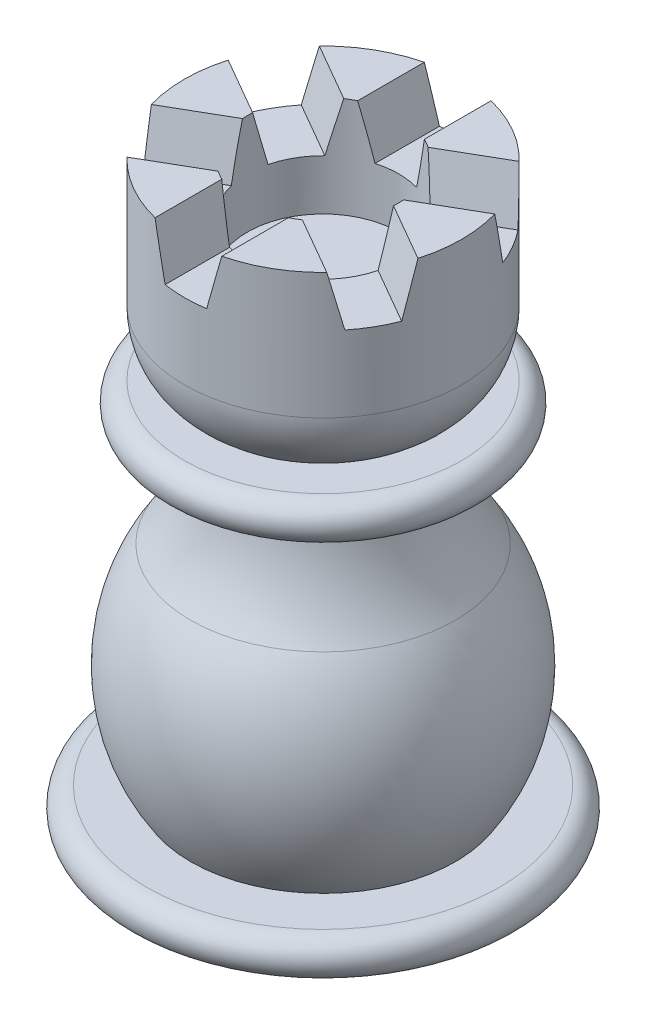
ISO-10303-21;
HEADER;
FILE_DESCRIPTION(('STEP AP214'),'2;1');
FILE_NAME('part.step','',(''),(''),'','','');
FILE_SCHEMA(('AUTOMOTIVE_DESIGN { 1 0 10303 214 1 1 1 1 }'));
ENDSEC;
DATA;
#1=APPLICATION_CONTEXT('core data for automotive mechanical design processes');
#2=APPLICATION_PROTOCOL_DEFINITION('international standard','automotive_design',2000,#1);
#3=PRODUCT_CONTEXT('',#1,'mechanical');
#4=PRODUCT('Part','Part','',(#3));
#5=PRODUCT_RELATED_PRODUCT_CATEGORY('part','',(#4));
#6=PRODUCT_DEFINITION_FORMATION('','',#4);
#7=PRODUCT_DEFINITION_CONTEXT('part definition',#1,'design');
#8=PRODUCT_DEFINITION('design','',#6,#7);
#9=PRODUCT_DEFINITION_SHAPE('','',#8);
#10=(LENGTH_UNIT() NAMED_UNIT(*) SI_UNIT(.MILLI.,.METRE.));
#11=(NAMED_UNIT(*) PLANE_ANGLE_UNIT() SI_UNIT($,.RADIAN.));
#12=(NAMED_UNIT(*) SI_UNIT($,.STERADIAN.) SOLID_ANGLE_UNIT());
#13=UNCERTAINTY_MEASURE_WITH_UNIT(LENGTH_MEASURE(1.E-05),#10,'distance_accuracy_value','');
#14=(GEOMETRIC_REPRESENTATION_CONTEXT(3) GLOBAL_UNCERTAINTY_ASSIGNED_CONTEXT((#13)) GLOBAL_UNIT_ASSIGNED_CONTEXT((#10,
#11,#12)) REPRESENTATION_CONTEXT('',''));
#15=CARTESIAN_POINT('',(0.,0.,0.));
#16=DIRECTION('',(0.,0.,1.));
#17=DIRECTION('',(1.,0.,0.));
#18=AXIS2_PLACEMENT_3D('',#15,#16,#17);
#19=CARTESIAN_POINT('',(0.,0.,0.));
#20=DIRECTION('',(0.,-1.,0.));
#21=DIRECTION('',(0.,0.,-1.));
#22=AXIS2_PLACEMENT_3D('',#19,#20,#21);
#23=PLANE('',#22);
#24=CARTESIAN_POINT('',(0.,0.,0.));
#25=DIRECTION('',(0.,1.,0.));
#26=DIRECTION('',(0.,0.,1.));
#27=AXIS2_PLACEMENT_3D('',#24,#25,#26);
#28=CIRCLE('',#27,11.0000000000006);
#29=CARTESIAN_POINT('',(10.5695682168455,0.,3.04700307014324));
#30=VERTEX_POINT('',#29);
#31=CARTESIAN_POINT('',(10.5695682168455,0.,-3.04700307014338));
#32=VERTEX_POINT('',#31);
#33=EDGE_CURVE('E392',#30,#32,#28,.T.);
#34=ORIENTED_EDGE('',*,*,#33,.T.);
#35=DIRECTION('',(0.866025403784436,0.,-0.500000000000004));
#36=VECTOR('',#35,1.);
#37=CARTESIAN_POINT('',(-17.0136958571946,0.,12.8782018681324));
#38=LINE('',#37,#36);
#39=CARTESIAN_POINT('',(5.98658386007074,0.,-0.40101581806761));
#40=VERTEX_POINT('',#39);
#41=EDGE_CURVE('E282',#40,#32,#38,.T.);
#42=ORIENTED_EDGE('',*,*,#41,.F.);
#43=CARTESIAN_POINT('',(0.,0.,0.));
#44=DIRECTION('',(0.,1.,0.));
#45=DIRECTION('',(0.,0.,1.));
#46=AXIS2_PLACEMENT_3D('',#43,#44,#45);
#47=CIRCLE('',#46,6.);
#48=CARTESIAN_POINT('',(5.98658386007075,0.,0.401015818067528));
#49=VERTEX_POINT('',#48);
#50=EDGE_CURVE('E305',#49,#40,#47,.T.);
#51=ORIENTED_EDGE('',*,*,#50,.F.);
#52=DIRECTION('',(-0.866025403784443,0.,-0.499999999999992));
#53=VECTOR('',#52,1.);
#54=CARTESIAN_POINT('',(19.6596979014642,0.,8.2951918905263));
#55=LINE('',#54,#53);
#56=EDGE_CURVE('E265',#30,#49,#55,.T.);
#57=ORIENTED_EDGE('',*,*,#56,.F.);
#58=EDGE_LOOP('',(#34,#42,#51,#57));
#59=FACE_BOUND('',#58,.T.);
#60=ADVANCED_FACE('F43',(#59),#23,.F.);
#61=CARTESIAN_POINT('',(2.64600204426945,0.,10.6770161178925));
#62=VERTEX_POINT('',#61);
#63=CARTESIAN_POINT('',(7.92356617257607,0.,7.63001304774911));
#64=VERTEX_POINT('',#63);
#65=EDGE_CURVE('E300',#62,#64,#28,.T.);
#66=ORIENTED_EDGE('',*,*,#65,.T.);
#67=DIRECTION('',(0.86602540378444,0.,0.499999999999998));
#68=VECTOR('',#67,1.);
#69=CARTESIAN_POINT('',(-19.6596979014641,0.,-8.29519189052646));
#70=LINE('',#69,#68);
#71=CARTESIAN_POINT('',(3.34058181580131,0.,4.98402579567338));
#72=VERTEX_POINT('',#71);
#73=EDGE_CURVE('E276',#72,#64,#70,.T.);
#74=ORIENTED_EDGE('',*,*,#73,.F.);
#75=CARTESIAN_POINT('',(2.64600204426945,0.,5.38504161374097));
#76=VERTEX_POINT('',#75);
#77=EDGE_CURVE('E299',#76,#72,#47,.T.);
#78=ORIENTED_EDGE('',*,*,#77,.F.);
#79=DIRECTION('',(0.,0.,-1.));
#80=VECTOR('',#79,1.);
#81=CARTESIAN_POINT('',(2.64600204426945,0.,15.5));
#82=LINE('',#81,#80);
#83=EDGE_CURVE('E267',#62,#76,#82,.T.);
#84=ORIENTED_EDGE('',*,*,#83,.F.);
#85=EDGE_LOOP('',(#66,#74,#78,#84));
#86=FACE_BOUND('',#85,.T.);
#87=ADVANCED_FACE('F297',(#86),#23,.F.);
#88=CARTESIAN_POINT('',(-3.34058181580128,0.,4.9840257956734));
#89=VERTEX_POINT('',#88);
#90=CARTESIAN_POINT('',(-2.64600204426945,0.,5.38504161374096));
#91=VERTEX_POINT('',#90);
#92=EDGE_CURVE('E313',#89,#91,#47,.T.);
#93=ORIENTED_EDGE('',*,*,#92,.F.);
#94=CARTESIAN_POINT('',(-7.92356617257602,0.,7.63001304774917));
#95=VERTEX_POINT('',#94);
#96=EDGE_CURVE('E281',#95,#89,#38,.T.);
#97=ORIENTED_EDGE('',*,*,#96,.F.);
#98=CARTESIAN_POINT('',(-2.64600204426945,0.,10.6770161178925));
#99=VERTEX_POINT('',#98);
#100=EDGE_CURVE('E376',#95,#99,#28,.T.);
#101=ORIENTED_EDGE('',*,*,#100,.T.);
#102=DIRECTION('',(0.,0.,1.));
#103=VECTOR('',#102,1.);
#104=CARTESIAN_POINT('',(-2.64600204426945,0.,-15.5));
#105=LINE('',#104,#103);
#106=EDGE_CURVE('E337',#91,#99,#105,.T.);
#107=ORIENTED_EDGE('',*,*,#106,.F.);
#108=EDGE_LOOP('',(#93,#97,#101,#107));
#109=FACE_BOUND('',#108,.T.);
#110=ADVANCED_FACE('F418',(#109),#23,.F.);
#111=CARTESIAN_POINT('',(-5.98658386007075,0.,-0.401015818067571));
#112=VERTEX_POINT('',#111);
#113=CARTESIAN_POINT('',(-5.98658386007075,0.,0.40101581806766));
#114=VERTEX_POINT('',#113);
#115=EDGE_CURVE('E316',#112,#114,#47,.T.);
#116=ORIENTED_EDGE('',*,*,#115,.F.);
#117=CARTESIAN_POINT('',(-10.5695682168455,0.,-3.0470030701433));
#118=VERTEX_POINT('',#117);
#119=EDGE_CURVE('E285',#118,#112,#70,.T.);
#120=ORIENTED_EDGE('',*,*,#119,.F.);
#121=CARTESIAN_POINT('',(-10.5695682168455,0.,3.04700307014346));
#122=VERTEX_POINT('',#121);
#123=EDGE_CURVE('E379',#118,#122,#28,.T.);
#124=ORIENTED_EDGE('',*,*,#123,.T.);
#125=DIRECTION('',(-0.866025403784433,0.,0.50000000000001));
#126=VECTOR('',#125,1.);
#127=CARTESIAN_POINT('',(17.0136958571946,0.,-12.8782018681325));
#128=LINE('',#127,#126);
#129=EDGE_CURVE('E271',#114,#122,#128,.T.);
#130=ORIENTED_EDGE('',*,*,#129,.F.);
#131=EDGE_LOOP('',(#116,#120,#124,#130));
#132=FACE_BOUND('',#131,.T.);
#133=ADVANCED_FACE('F420',(#132),#23,.F.);
#134=CARTESIAN_POINT('',(7.92356617257596,0.,-7.63001304774922));
#135=VERTEX_POINT('',#134);
#136=CARTESIAN_POINT('',(2.64600204426945,0.,-10.6770161178925));
#137=VERTEX_POINT('',#136);
#138=EDGE_CURVE('E384',#135,#137,#28,.T.);
#139=ORIENTED_EDGE('',*,*,#138,.T.);
#140=CARTESIAN_POINT('',(2.64600204426945,0.,-5.38504161374096));
#141=VERTEX_POINT('',#140);
#142=EDGE_CURVE('E264',#141,#137,#82,.T.);
#143=ORIENTED_EDGE('',*,*,#142,.F.);
#144=CARTESIAN_POINT('',(3.34058181580124,0.,-4.98402579567342));
#145=VERTEX_POINT('',#144);
#146=EDGE_CURVE('E312',#145,#141,#47,.T.);
#147=ORIENTED_EDGE('',*,*,#146,.F.);
#148=EDGE_CURVE('E444',#135,#145,#128,.T.);
#149=ORIENTED_EDGE('',*,*,#148,.F.);
#150=EDGE_LOOP('',(#139,#143,#147,#149));
#151=FACE_BOUND('',#150,.T.);
#152=ADVANCED_FACE('F425',(#151),#23,.F.);
#153=CARTESIAN_POINT('',(-2.64600204426945,0.,-10.6770161178925));
#154=VERTEX_POINT('',#153);
#155=CARTESIAN_POINT('',(-7.92356617257611,0.,-7.63001304774905));
#156=VERTEX_POINT('',#155);
#157=EDGE_CURVE('E382',#154,#156,#28,.T.);
#158=ORIENTED_EDGE('',*,*,#157,.T.);
#159=CARTESIAN_POINT('',(-3.34058181580134,0.,-4.98402579567335));
#160=VERTEX_POINT('',#159);
#161=EDGE_CURVE('E205',#160,#156,#55,.T.);
#162=ORIENTED_EDGE('',*,*,#161,.F.);
#163=CARTESIAN_POINT('',(-2.64600204426945,0.,-5.38504161374097));
#164=VERTEX_POINT('',#163);
#165=EDGE_CURVE('E307',#164,#160,#47,.T.);
#166=ORIENTED_EDGE('',*,*,#165,.F.);
#167=EDGE_CURVE('E340',#154,#164,#105,.T.);
#168=ORIENTED_EDGE('',*,*,#167,.F.);
#169=EDGE_LOOP('',(#158,#162,#166,#168));
#170=FACE_BOUND('',#169,.T.);
#171=ADVANCED_FACE('F45',(#170),#23,.F.);
#172=CARTESIAN_POINT('',(0.,0.,0.));
#173=DIRECTION('',(0.,1.,0.));
#174=DIRECTION('',(0.,0.,1.));
#175=AXIS2_PLACEMENT_3D('',#172,#173,#174);
#176=CYLINDRICAL_SURFACE('',#175,11.0000000000006);
#177=ORIENTED_EDGE('',*,*,#65,.F.);
#178=CARTESIAN_POINT('',(0.,-10.6125345492527,0.));
#179=DIRECTION('',(0.970295726275996,-0.241921895599669,0.));
#180=DIRECTION('',(0.241921895599669,0.970295726275996,0.));
#181=AXIS2_PLACEMENT_3D('',#178,#179,#180);
#182=ELLIPSE('',#181,45.4692204388286,11.0000000000006);
#183=CARTESIAN_POINT('',(1.64869003289672,-4.,10.8757446262516));
#184=VERTEX_POINT('',#183);
#185=EDGE_CURVE('E243',#62,#184,#182,.T.);
#186=ORIENTED_EDGE('',*,*,#185,.T.);
#187=CARTESIAN_POINT('',(0.,-4.,0.));
#188=DIRECTION('',(0.,-1.,0.));
#189=DIRECTION('',(1.,0.,0.));
#190=AXIS2_PLACEMENT_3D('',#187,#188,#189);
#191=CIRCLE('',#190,11.0000000000006);
#192=CARTESIAN_POINT('',(-1.64869003289672,-4.,10.8757446262516));
#193=VERTEX_POINT('',#192);
#194=EDGE_CURVE('E321',#184,#193,#191,.T.);
#195=ORIENTED_EDGE('',*,*,#194,.T.);
#196=CARTESIAN_POINT('',(0.,-10.6125345492527,0.));
#197=DIRECTION('',(-0.970295726275996,-0.241921895599669,0.));
#198=DIRECTION('',(-0.241921895599669,0.970295726275996,0.));
#199=AXIS2_PLACEMENT_3D('',#196,#197,#198);
#200=ELLIPSE('',#199,45.4692204388286,11.0000000000006);
#201=EDGE_CURVE('E334',#193,#99,#200,.T.);
#202=ORIENTED_EDGE('',*,*,#201,.T.);
#203=ORIENTED_EDGE('',*,*,#100,.F.);
#204=CARTESIAN_POINT('',(0.,-10.6125345492527,0.));
#205=DIRECTION('',(0.485147863138002,-0.241921895599669,0.840300748138482));
#206=DIRECTION('',(0.120960947799835,0.970295726275996,0.209510507321));
#207=AXIS2_PLACEMENT_3D('',#204,#205,#206);
#208=ELLIPSE('',#207,45.4692204388286,11.0000000000006);
#209=CARTESIAN_POINT('',(-8.59432611495759,-4.,6.8656797645806));
#210=VERTEX_POINT('',#209);
#211=EDGE_CURVE('E349',#95,#210,#208,.T.);
#212=ORIENTED_EDGE('',*,*,#211,.T.);
#213=CARTESIAN_POINT('',(0.,-4.,0.));
#214=DIRECTION('',(0.,-1.,0.));
#215=DIRECTION('',(0.,0.,-1.));
#216=AXIS2_PLACEMENT_3D('',#213,#214,#215);
#217=CIRCLE('',#216,11.0000000000006);
#218=CARTESIAN_POINT('',(-10.2430161478543,-4.,4.01006486167109));
#219=VERTEX_POINT('',#218);
#220=EDGE_CURVE('E230',#210,#219,#217,.T.);
#221=ORIENTED_EDGE('',*,*,#220,.T.);
#222=CARTESIAN_POINT('',(0.,-10.6125345492527,0.));
#223=DIRECTION('',(-0.485147863138008,-0.241921895599669,-0.840300748138479));
#224=DIRECTION('',(-0.120960947799837,0.970295726275996,-0.209510507320999));
#225=AXIS2_PLACEMENT_3D('',#222,#223,#224);
#226=ELLIPSE('',#225,45.4692204388286,11.0000000000006);
#227=EDGE_CURVE('E352',#219,#122,#226,.T.);
#228=ORIENTED_EDGE('',*,*,#227,.T.);
#229=ORIENTED_EDGE('',*,*,#123,.F.);
#230=CARTESIAN_POINT('',(0.,-10.6125345492527,0.));
#231=DIRECTION('',(-0.485147863137996,-0.241921895599669,0.840300748138486));
#232=DIRECTION('',(-0.120960947799834,0.970295726275996,0.209510507321));
#233=AXIS2_PLACEMENT_3D('',#230,#231,#232);
#234=ELLIPSE('',#233,45.4692204388286,11.0000000000006);
#235=CARTESIAN_POINT('',(-10.2430161478543,-4.,-4.01006486167101));
#236=VERTEX_POINT('',#235);
#237=EDGE_CURVE('E229',#118,#236,#234,.T.);
#238=ORIENTED_EDGE('',*,*,#237,.T.);
#239=CARTESIAN_POINT('',(-8.59432611495765,-4.,-6.86567976458055));
#240=VERTEX_POINT('',#239);
#241=EDGE_CURVE('E216',#236,#240,#217,.T.);
#242=ORIENTED_EDGE('',*,*,#241,.T.);
#243=CARTESIAN_POINT('',(0.,-10.6125345492527,0.));
#244=DIRECTION('',(0.48514786313799,-0.241921895599669,-0.840300748138489));
#245=DIRECTION('',(0.120960947799832,0.970295726275996,-0.209510507321001));
#246=AXIS2_PLACEMENT_3D('',#243,#244,#245);
#247=ELLIPSE('',#246,45.4692204388286,11.0000000000006);
#248=EDGE_CURVE('E202',#240,#156,#247,.T.);
#249=ORIENTED_EDGE('',*,*,#248,.T.);
#250=ORIENTED_EDGE('',*,*,#157,.F.);
#251=CARTESIAN_POINT('',(-1.64869003289672,-4.,-10.8757446262516));
#252=VERTEX_POINT('',#251);
#253=EDGE_CURVE('E332',#154,#252,#200,.T.);
#254=ORIENTED_EDGE('',*,*,#253,.T.);
#255=CARTESIAN_POINT('',(1.64869003289672,-4.,-10.8757446262516));
#256=VERTEX_POINT('',#255);
#257=EDGE_CURVE('E326',#252,#256,#191,.T.);
#258=ORIENTED_EDGE('',*,*,#257,.T.);
#259=CARTESIAN_POINT('',(0.,-10.6125345492527,0.));
#260=DIRECTION('',(0.970295726275996,-0.241921895599669,0.));
#261=DIRECTION('',(0.241921895599669,0.970295726275996,0.));
#262=AXIS2_PLACEMENT_3D('',#259,#260,#261);
#263=ELLIPSE('',#262,45.4692204388286,11.0000000000006);
#264=EDGE_CURVE('E359',#256,#137,#263,.T.);
#265=ORIENTED_EDGE('',*,*,#264,.T.);
#266=ORIENTED_EDGE('',*,*,#138,.F.);
#267=CARTESIAN_POINT('',(0.,-10.6125345492527,0.));
#268=DIRECTION('',(-0.485147863138008,-0.241921895599669,-0.840300748138479));
#269=DIRECTION('',(-0.120960947799837,0.970295726275996,-0.209510507320999));
#270=AXIS2_PLACEMENT_3D('',#267,#268,#269);
#271=ELLIPSE('',#270,45.4692204388286,11.0000000000006);
#272=CARTESIAN_POINT('',(8.59432611495753,-4.,-6.86567976458066));
#273=VERTEX_POINT('',#272);
#274=EDGE_CURVE('E210',#135,#273,#271,.T.);
#275=ORIENTED_EDGE('',*,*,#274,.T.);
#276=CARTESIAN_POINT('',(10.2430161478543,-4.,-4.01006486167108));
#277=VERTEX_POINT('',#276);
#278=EDGE_CURVE('E232',#273,#277,#217,.T.);
#279=ORIENTED_EDGE('',*,*,#278,.T.);
#280=CARTESIAN_POINT('',(0.,-10.6125345492527,0.));
#281=DIRECTION('',(0.485147863138002,-0.241921895599669,0.840300748138482));
#282=DIRECTION('',(0.120960947799835,0.970295726275996,0.209510507321));
#283=AXIS2_PLACEMENT_3D('',#280,#281,#282);
#284=ELLIPSE('',#283,45.4692204388286,11.0000000000006);
#285=EDGE_CURVE('E355',#277,#32,#284,.T.);
#286=ORIENTED_EDGE('',*,*,#285,.T.);
#287=ORIENTED_EDGE('',*,*,#33,.F.);
#288=CARTESIAN_POINT('',(0.,-10.6125345492527,0.));
#289=DIRECTION('',(0.48514786313799,-0.241921895599669,-0.840300748138489));
#290=DIRECTION('',(0.120960947799832,0.970295726275996,-0.209510507321001));
#291=AXIS2_PLACEMENT_3D('',#288,#289,#290);
#292=ELLIPSE('',#291,45.4692204388286,11.0000000000006);
#293=CARTESIAN_POINT('',(10.2430161478544,-4.,4.01006486167095));
#294=VERTEX_POINT('',#293);
#295=EDGE_CURVE('E211',#30,#294,#292,.T.);
#296=ORIENTED_EDGE('',*,*,#295,.T.);
#297=CARTESIAN_POINT('',(8.59432611495763,-4.,6.86567976458054));
#298=VERTEX_POINT('',#297);
#299=EDGE_CURVE('E234',#294,#298,#217,.T.);
#300=ORIENTED_EDGE('',*,*,#299,.T.);
#301=CARTESIAN_POINT('',(0.,-10.6125345492527,0.));
#302=DIRECTION('',(-0.485147863137996,-0.241921895599669,0.840300748138486));
#303=DIRECTION('',(-0.120960947799834,0.970295726275996,0.209510507321));
#304=AXIS2_PLACEMENT_3D('',#301,#302,#303);
#305=ELLIPSE('',#304,45.4692204388286,11.0000000000006);
#306=EDGE_CURVE('E247',#298,#64,#305,.T.);
#307=ORIENTED_EDGE('',*,*,#306,.T.);
#308=EDGE_LOOP('',(#177,#186,#195,#202,#203,#212,#221,#228,#229,#238,#242,#249,#250,#254,#258,
#265,#266,#275,#279,#286,#287,#296,#300,#307));
#309=FACE_BOUND('',#308,.T.);
#310=CARTESIAN_POINT('',(0.,-10.,0.));
#311=DIRECTION('',(0.,1.,0.));
#312=DIRECTION('',(0.,0.,1.));
#313=AXIS2_PLACEMENT_3D('',#310,#311,#312);
#314=CIRCLE('',#313,11.0000000000006);
#315=CARTESIAN_POINT('',(0.,-10.,11.0000000000006));
#316=VERTEX_POINT('',#315);
#317=EDGE_CURVE('E380',#316,#316,#314,.T.);
#318=ORIENTED_EDGE('',*,*,#317,.T.);
#319=EDGE_LOOP('',(#318));
#320=FACE_BOUND('',#319,.T.);
#321=ADVANCED_FACE('F226',(#309,#320),#176,.T.);
#322=CARTESIAN_POINT('',(0.,-10.,0.));
#323=DIRECTION('',(0.,1.,0.));
#324=DIRECTION('',(0.,0.,1.));
#325=AXIS2_PLACEMENT_3D('',#322,#323,#324);
#326=DEGENERATE_TOROIDAL_SURFACE('',#325,5.00000000000061,5.99999999999985,.T.);
#327=ORIENTED_EDGE('',*,*,#317,.F.);
#328=EDGE_LOOP('',(#327));
#329=FACE_BOUND('',#328,.T.);
#330=CARTESIAN_POINT('',(0.,-15.1961524227068,0.));
#331=DIRECTION('',(0.,1.,0.));
#332=DIRECTION('',(0.,0.,1.));
#333=AXIS2_PLACEMENT_3D('',#330,#331,#332);
#334=CIRCLE('',#333,8.00000000000008);
#335=CARTESIAN_POINT('',(0.,-15.1961524227068,8.00000000000008));
#336=VERTEX_POINT('',#335);
#337=EDGE_CURVE('E386',#336,#336,#334,.T.);
#338=ORIENTED_EDGE('',*,*,#337,.T.);
#339=EDGE_LOOP('',(#338));
#340=FACE_BOUND('',#339,.T.);
#341=ADVANCED_FACE('F436',(#329,#340),#326,.T.);
#342=CARTESIAN_POINT('',(8.,-15.1961524227067,0.));
#343=DIRECTION('',(0.,-1.,0.));
#344=DIRECTION('',(0.,0.,-1.));
#345=AXIS2_PLACEMENT_3D('',#342,#343,#344);
#346=PLANE('',#345);
#347=ORIENTED_EDGE('',*,*,#337,.F.);
#348=EDGE_LOOP('',(#347));
#349=FACE_BOUND('',#348,.T.);
#350=CARTESIAN_POINT('',(0.,-15.1961524227066,0.));
#351=DIRECTION('',(0.,1.,0.));
#352=DIRECTION('',(0.,0.,1.));
#353=AXIS2_PLACEMENT_3D('',#350,#351,#352);
#354=CIRCLE('',#353,11.);
#355=CARTESIAN_POINT('',(0.,-15.1961524227066,11.));
#356=VERTEX_POINT('',#355);
#357=EDGE_CURVE('E768',#356,#356,#354,.T.);
#358=ORIENTED_EDGE('',*,*,#357,.T.);
#359=EDGE_LOOP('',(#358));
#360=FACE_BOUND('',#359,.T.);
#361=ADVANCED_FACE('F716',(#349,#360),#346,.F.);
#362=CARTESIAN_POINT('',(0.,-16.6961524227066,0.));
#363=DIRECTION('',(0.,1.,0.));
#364=DIRECTION('',(0.,0.,1.));
#365=AXIS2_PLACEMENT_3D('',#362,#363,#364);
#366=TOROIDAL_SURFACE('',#365,11.,1.5);
#367=ORIENTED_EDGE('',*,*,#357,.F.);
#368=EDGE_LOOP('',(#367));
#369=FACE_BOUND('',#368,.T.);
#370=CARTESIAN_POINT('',(0.,-18.1961524227066,0.));
#371=DIRECTION('',(0.,1.,0.));
#372=DIRECTION('',(0.,0.,1.));
#373=AXIS2_PLACEMENT_3D('',#370,#371,#372);
#374=CIRCLE('',#373,11.);
#375=CARTESIAN_POINT('',(0.,-18.1961524227066,11.));
#376=VERTEX_POINT('',#375);
#377=EDGE_CURVE('E771',#376,#376,#374,.T.);
#378=ORIENTED_EDGE('',*,*,#377,.T.);
#379=EDGE_LOOP('',(#378));
#380=FACE_BOUND('',#379,.T.);
#381=ADVANCED_FACE('F707',(#369,#380),#366,.T.);
#382=CARTESIAN_POINT('',(11.,-18.1961524227066,0.));
#383=DIRECTION('',(0.,1.,0.));
#384=DIRECTION('',(0.,0.,1.));
#385=AXIS2_PLACEMENT_3D('',#382,#383,#384);
#386=PLANE('',#385);
#387=ORIENTED_EDGE('',*,*,#377,.F.);
#388=EDGE_LOOP('',(#387));
#389=FACE_BOUND('',#388,.T.);
#390=CARTESIAN_POINT('',(0.,-18.1961524227066,0.));
#391=DIRECTION('',(0.,1.,0.));
#392=DIRECTION('',(0.,0.,1.));
#393=AXIS2_PLACEMENT_3D('',#390,#391,#392);
#394=CIRCLE('',#393,8.);
#395=CARTESIAN_POINT('',(0.,-18.1961524227066,8.));
#396=VERTEX_POINT('',#395);
#397=EDGE_CURVE('E776',#396,#396,#394,.T.);
#398=ORIENTED_EDGE('',*,*,#397,.T.);
#399=EDGE_LOOP('',(#398));
#400=FACE_BOUND('',#399,.T.);
#401=ADVANCED_FACE('F698',(#389,#400),#386,.F.);
#402=CARTESIAN_POINT('',(0.,-18.1245409801866,0.));
#403=DIRECTION('',(0.,1.,0.));
#404=DIRECTION('',(0.,0.,1.));
#405=AXIS2_PLACEMENT_3D('',#402,#403,#404);
#406=TOROIDAL_SURFACE('',#405,22.9998290590693,15.);
#407=ORIENTED_EDGE('',*,*,#397,.F.);
#408=EDGE_LOOP('',(#407));
#409=FACE_BOUND('',#408,.T.);
#410=CARTESIAN_POINT('',(0.,-26.4163606534577,0.));
#411=DIRECTION('',(0.,1.,0.));
#412=DIRECTION('',(0.,0.,1.));
#413=AXIS2_PLACEMENT_3D('',#410,#411,#412);
#414=CIRCLE('',#413,10.5);
#415=CARTESIAN_POINT('',(0.,-26.4163606534577,10.5));
#416=VERTEX_POINT('',#415);
#417=EDGE_CURVE('E779',#416,#416,#414,.T.);
#418=ORIENTED_EDGE('',*,*,#417,.T.);
#419=EDGE_LOOP('',(#418));
#420=FACE_BOUND('',#419,.T.);
#421=ADVANCED_FACE('F689',(#409,#420),#406,.F.);
#422=CARTESIAN_POINT('',(0.,-34.7081803267289,0.));
#423=DIRECTION('',(0.,1.,0.));
#424=DIRECTION('',(0.,0.,1.));
#425=AXIS2_PLACEMENT_3D('',#422,#423,#424);
#426=DEGENERATE_TOROIDAL_SURFACE('',#425,1.99982905906933,15.,.F.);
#427=ORIENTED_EDGE('',*,*,#417,.F.);
#428=EDGE_LOOP('',(#427));
#429=FACE_BOUND('',#428,.T.);
#430=CARTESIAN_POINT('',(0.,-43.,0.));
#431=DIRECTION('',(0.,1.,0.));
#432=DIRECTION('',(0.,0.,1.));
#433=AXIS2_PLACEMENT_3D('',#430,#431,#432);
#434=CIRCLE('',#433,10.5);
#435=CARTESIAN_POINT('',(0.,-43.,10.5));
#436=VERTEX_POINT('',#435);
#437=EDGE_CURVE('E782',#436,#436,#434,.T.);
#438=ORIENTED_EDGE('',*,*,#437,.T.);
#439=EDGE_LOOP('',(#438));
#440=FACE_BOUND('',#439,.T.);
#441=ADVANCED_FACE('F680',(#429,#440),#426,.F.);
#442=CARTESIAN_POINT('',(10.5,-43.,0.));
#443=DIRECTION('',(0.,-1.,0.));
#444=DIRECTION('',(0.,0.,-1.));
#445=AXIS2_PLACEMENT_3D('',#442,#443,#444);
#446=PLANE('',#445);
#447=ORIENTED_EDGE('',*,*,#437,.F.);
#448=EDGE_LOOP('',(#447));
#449=FACE_BOUND('',#448,.T.);
#450=CARTESIAN_POINT('',(0.,-43.,0.));
#451=DIRECTION('',(0.,1.,0.));
#452=DIRECTION('',(0.,0.,1.));
#453=AXIS2_PLACEMENT_3D('',#450,#451,#452);
#454=CIRCLE('',#453,14.);
#455=CARTESIAN_POINT('',(0.,-43.,14.));
#456=VERTEX_POINT('',#455);
#457=EDGE_CURVE('E785',#456,#456,#454,.T.);
#458=ORIENTED_EDGE('',*,*,#457,.T.);
#459=EDGE_LOOP('',(#458));
#460=FACE_BOUND('',#459,.T.);
#461=ADVANCED_FACE('F671',(#449,#460),#446,.F.);
#462=CARTESIAN_POINT('',(0.,-44.5,0.));
#463=DIRECTION('',(0.,1.,0.));
#464=DIRECTION('',(0.,0.,1.));
#465=AXIS2_PLACEMENT_3D('',#462,#463,#464);
#466=TOROIDAL_SURFACE('',#465,14.,1.5);
#467=ORIENTED_EDGE('',*,*,#457,.F.);
#468=EDGE_LOOP('',(#467));
#469=FACE_BOUND('',#468,.T.);
#470=CARTESIAN_POINT('',(0.,-46.,0.));
#471=DIRECTION('',(0.,1.,0.));
#472=DIRECTION('',(0.,0.,1.));
#473=AXIS2_PLACEMENT_3D('',#470,#471,#472);
#474=CIRCLE('',#473,14.);
#475=CARTESIAN_POINT('',(0.,-46.,14.));
#476=VERTEX_POINT('',#475);
#477=EDGE_CURVE('E309',#476,#476,#474,.T.);
#478=ORIENTED_EDGE('',*,*,#477,.T.);
#479=EDGE_LOOP('',(#478));
#480=FACE_BOUND('',#479,.T.);
#481=ADVANCED_FACE('F662',(#469,#480),#466,.T.);
#482=CARTESIAN_POINT('',(14.,-46.,0.));
#483=DIRECTION('',(0.,1.,0.));
#484=DIRECTION('',(0.,0.,1.));
#485=AXIS2_PLACEMENT_3D('',#482,#483,#484);
#486=PLANE('',#485);
#487=ORIENTED_EDGE('',*,*,#477,.F.);
#488=EDGE_LOOP('',(#487));
#489=FACE_BOUND('',#488,.T.);
#490=ADVANCED_FACE('F653',(#489),#486,.F.);
#491=CARTESIAN_POINT('',(0.,-8.,0.));
#492=DIRECTION('',(0.,1.,0.));
#493=DIRECTION('',(0.,0.,1.));
#494=AXIS2_PLACEMENT_3D('',#491,#492,#493);
#495=CYLINDRICAL_SURFACE('',#494,6.);
#496=CARTESIAN_POINT('',(0.,-8.,0.));
#497=DIRECTION('',(0.,1.,0.));
#498=DIRECTION('',(0.,0.,1.));
#499=AXIS2_PLACEMENT_3D('',#496,#497,#498);
#500=CIRCLE('',#499,6.);
#501=CARTESIAN_POINT('',(0.,-8.,6.));
#502=VERTEX_POINT('',#501);
#503=EDGE_CURVE('E304',#502,#502,#500,.T.);
#504=ORIENTED_EDGE('',*,*,#503,.F.);
#505=EDGE_LOOP('',(#504));
#506=FACE_BOUND('',#505,.T.);
#507=CARTESIAN_POINT('',(0.,-4.,0.));
#508=DIRECTION('',(0.,-1.,0.));
#509=DIRECTION('',(1.,0.,0.));
#510=AXIS2_PLACEMENT_3D('',#507,#508,#509);
#511=CIRCLE('',#510,6.);
#512=CARTESIAN_POINT('',(-1.64869003289672,-4.,5.76903988332781));
#513=VERTEX_POINT('',#512);
#514=CARTESIAN_POINT('',(1.64869003289672,-4.,5.76903988332782));
#515=VERTEX_POINT('',#514);
#516=EDGE_CURVE('E370',#513,#515,#511,.F.);
#517=ORIENTED_EDGE('',*,*,#516,.T.);
#518=CARTESIAN_POINT('',(0.,-10.6125345492527,0.));
#519=DIRECTION('',(0.970295726275996,-0.241921895599669,0.));
#520=DIRECTION('',(0.241921895599669,0.970295726275996,0.));
#521=AXIS2_PLACEMENT_3D('',#518,#519,#520);
#522=ELLIPSE('',#521,24.8013929666324,6.);
#523=EDGE_CURVE('E239',#515,#76,#522,.F.);
#524=ORIENTED_EDGE('',*,*,#523,.T.);
#525=ORIENTED_EDGE('',*,*,#77,.T.);
#526=CARTESIAN_POINT('',(0.,-10.6125345492527,0.));
#527=DIRECTION('',(-0.485147863137996,-0.241921895599669,0.840300748138486));
#528=DIRECTION('',(-0.120960947799834,0.970295726275996,0.209510507321));
#529=AXIS2_PLACEMENT_3D('',#526,#527,#528);
#530=ELLIPSE('',#529,24.8013929666324,6.);
#531=CARTESIAN_POINT('',(4.17179007795915,-4.,4.31232739311866));
#532=VERTEX_POINT('',#531);
#533=EDGE_CURVE('E293',#72,#532,#530,.F.);
#534=ORIENTED_EDGE('',*,*,#533,.T.);
#535=CARTESIAN_POINT('',(0.,-4.,0.));
#536=DIRECTION('',(0.,-1.,0.));
#537=DIRECTION('',(0.,0.,-1.));
#538=AXIS2_PLACEMENT_3D('',#535,#536,#537);
#539=CIRCLE('',#538,6.);
#540=CARTESIAN_POINT('',(5.82048011085589,-4.,1.4567124902091));
#541=VERTEX_POINT('',#540);
#542=EDGE_CURVE('E410',#532,#541,#539,.F.);
#543=ORIENTED_EDGE('',*,*,#542,.T.);
#544=CARTESIAN_POINT('',(0.,-10.6125345492527,0.));
#545=DIRECTION('',(0.48514786313799,-0.241921895599669,-0.840300748138489));
#546=DIRECTION('',(0.120960947799832,0.970295726275996,-0.209510507321001));
#547=AXIS2_PLACEMENT_3D('',#544,#545,#546);
#548=ELLIPSE('',#547,24.8013929666324,6.);
#549=EDGE_CURVE('E263',#541,#49,#548,.F.);
#550=ORIENTED_EDGE('',*,*,#549,.T.);
#551=ORIENTED_EDGE('',*,*,#50,.T.);
#552=CARTESIAN_POINT('',(0.,-10.6125345492527,0.));
#553=DIRECTION('',(0.485147863138002,-0.241921895599669,0.840300748138482));
#554=DIRECTION('',(0.120960947799835,0.970295726275996,0.209510507321));
#555=AXIS2_PLACEMENT_3D('',#552,#553,#554);
#556=ELLIPSE('',#555,24.8013929666324,6.);
#557=CARTESIAN_POINT('',(5.82048011085585,-4.,-1.45671249020917));
#558=VERTEX_POINT('',#557);
#559=EDGE_CURVE('E465',#40,#558,#556,.F.);
#560=ORIENTED_EDGE('',*,*,#559,.T.);
#561=CARTESIAN_POINT('',(4.17179007795909,-4.,-4.31232739311872));
#562=VERTEX_POINT('',#561);
#563=EDGE_CURVE('E221',#558,#562,#539,.F.);
#564=ORIENTED_EDGE('',*,*,#563,.T.);
#565=CARTESIAN_POINT('',(0.,-10.6125345492527,0.));
#566=DIRECTION('',(-0.485147863138008,-0.241921895599669,-0.840300748138479));
#567=DIRECTION('',(-0.120960947799837,0.970295726275996,-0.209510507320999));
#568=AXIS2_PLACEMENT_3D('',#565,#566,#567);
#569=ELLIPSE('',#568,24.8013929666324,6.);
#570=EDGE_CURVE('E463',#562,#145,#569,.F.);
#571=ORIENTED_EDGE('',*,*,#570,.T.);
#572=ORIENTED_EDGE('',*,*,#146,.T.);
#573=CARTESIAN_POINT('',(0.,-10.6125345492527,0.));
#574=DIRECTION('',(0.970295726275996,-0.241921895599669,0.));
#575=DIRECTION('',(0.241921895599669,0.970295726275996,0.));
#576=AXIS2_PLACEMENT_3D('',#573,#574,#575);
#577=ELLIPSE('',#576,24.8013929666324,6.);
#578=CARTESIAN_POINT('',(1.64869003289672,-4.,-5.76903988332782));
#579=VERTEX_POINT('',#578);
#580=EDGE_CURVE('E362',#141,#579,#577,.F.);
#581=ORIENTED_EDGE('',*,*,#580,.T.);
#582=CARTESIAN_POINT('',(-1.64869003289672,-4.,-5.76903988332782));
#583=VERTEX_POINT('',#582);
#584=EDGE_CURVE('E394',#579,#583,#511,.F.);
#585=ORIENTED_EDGE('',*,*,#584,.T.);
#586=CARTESIAN_POINT('',(0.,-10.6125345492527,0.));
#587=DIRECTION('',(-0.970295726275996,-0.241921895599669,0.));
#588=DIRECTION('',(-0.241921895599669,0.970295726275996,0.));
#589=AXIS2_PLACEMENT_3D('',#586,#587,#588);
#590=ELLIPSE('',#589,24.8013929666324,6.);
#591=EDGE_CURVE('E393',#583,#164,#590,.F.);
#592=ORIENTED_EDGE('',*,*,#591,.T.);
#593=ORIENTED_EDGE('',*,*,#165,.T.);
#594=CARTESIAN_POINT('',(0.,-10.6125345492527,0.));
#595=DIRECTION('',(0.48514786313799,-0.241921895599669,-0.840300748138489));
#596=DIRECTION('',(0.120960947799832,0.970295726275996,-0.209510507321001));
#597=AXIS2_PLACEMENT_3D('',#594,#595,#596);
#598=ELLIPSE('',#597,24.8013929666324,6.);
#599=CARTESIAN_POINT('',(-4.17179007795917,-4.,-4.31232739311867));
#600=VERTEX_POINT('',#599);
#601=EDGE_CURVE('E457',#160,#600,#598,.F.);
#602=ORIENTED_EDGE('',*,*,#601,.T.);
#603=CARTESIAN_POINT('',(-5.82048011085587,-4.,-1.45671249020913));
#604=VERTEX_POINT('',#603);
#605=EDGE_CURVE('E219',#600,#604,#539,.F.);
#606=ORIENTED_EDGE('',*,*,#605,.T.);
#607=CARTESIAN_POINT('',(0.,-10.6125345492527,0.));
#608=DIRECTION('',(-0.485147863137996,-0.241921895599669,0.840300748138486));
#609=DIRECTION('',(-0.120960947799834,0.970295726275996,0.209510507321));
#610=AXIS2_PLACEMENT_3D('',#607,#608,#609);
#611=ELLIPSE('',#610,24.8013929666324,6.);
#612=EDGE_CURVE('E461',#604,#112,#611,.F.);
#613=ORIENTED_EDGE('',*,*,#612,.T.);
#614=ORIENTED_EDGE('',*,*,#115,.T.);
#615=CARTESIAN_POINT('',(0.,-10.6125345492527,0.));
#616=DIRECTION('',(-0.485147863138008,-0.241921895599669,-0.840300748138479));
#617=DIRECTION('',(-0.120960947799837,0.970295726275996,-0.209510507320999));
#618=AXIS2_PLACEMENT_3D('',#615,#616,#617);
#619=ELLIPSE('',#618,24.8013929666324,6.);
#620=CARTESIAN_POINT('',(-5.82048011085586,-4.,1.45671249020918));
#621=VERTEX_POINT('',#620);
#622=EDGE_CURVE('E51',#114,#621,#619,.F.);
#623=ORIENTED_EDGE('',*,*,#622,.T.);
#624=CARTESIAN_POINT('',(-4.17179007795913,-4.,4.31232739311869));
#625=VERTEX_POINT('',#624);
#626=EDGE_CURVE('E235',#621,#625,#539,.F.);
#627=ORIENTED_EDGE('',*,*,#626,.T.);
#628=CARTESIAN_POINT('',(0.,-10.6125345492527,0.));
#629=DIRECTION('',(0.485147863138002,-0.241921895599669,0.840300748138482));
#630=DIRECTION('',(0.120960947799835,0.970295726275996,0.209510507321));
#631=AXIS2_PLACEMENT_3D('',#628,#629,#630);
#632=ELLIPSE('',#631,24.8013929666324,6.);
#633=EDGE_CURVE('E11',#625,#89,#632,.F.);
#634=ORIENTED_EDGE('',*,*,#633,.T.);
#635=ORIENTED_EDGE('',*,*,#92,.T.);
#636=EDGE_CURVE('E373',#91,#513,#590,.F.);
#637=ORIENTED_EDGE('',*,*,#636,.T.);
#638=EDGE_LOOP('',(#517,#524,#525,#534,#543,#550,#551,#560,#564,#571,#572,#581,#585,#592,#593,
#602,#606,#613,#614,#623,#627,#634,#635,#637));
#639=FACE_BOUND('',#638,.T.);
#640=ADVANCED_FACE('F303',(#506,#639),#495,.F.);
#641=CARTESIAN_POINT('',(0.,-8.,0.));
#642=DIRECTION('',(0.,1.,0.));
#643=DIRECTION('',(0.,0.,1.));
#644=AXIS2_PLACEMENT_3D('',#641,#642,#643);
#645=PLANE('',#644);
#646=ORIENTED_EDGE('',*,*,#503,.T.);
#647=EDGE_LOOP('',(#646));
#648=FACE_BOUND('',#647,.T.);
#649=ADVANCED_FACE('F632',(#648),#645,.T.);
#650=CARTESIAN_POINT('',(-2.64600204426945,0.,-15.5));
#651=DIRECTION('',(-0.970295726275996,-0.241921895599669,0.));
#652=DIRECTION('',(0.241921895599669,-0.970295726275996,0.));
#653=AXIS2_PLACEMENT_3D('',#650,#651,#652);
#654=PLANE('',#653);
#655=ORIENTED_EDGE('',*,*,#167,.T.);
#656=ORIENTED_EDGE('',*,*,#591,.F.);
#657=DIRECTION('',(0.,0.,1.));
#658=VECTOR('',#657,1.);
#659=CARTESIAN_POINT('',(-1.64869003289672,-4.,-15.5));
#660=LINE('',#659,#658);
#661=EDGE_CURVE('E344',#252,#583,#660,.T.);
#662=ORIENTED_EDGE('',*,*,#661,.F.);
#663=ORIENTED_EDGE('',*,*,#253,.F.);
#664=EDGE_LOOP('',(#655,#656,#662,#663));
#665=FACE_BOUND('',#664,.T.);
#666=ADVANCED_FACE('F614',(#665),#654,.F.);
#667=CARTESIAN_POINT('',(-1.64869003289672,-4.,-15.5));
#668=DIRECTION('',(0.,-1.,0.));
#669=DIRECTION('',(1.,0.,0.));
#670=AXIS2_PLACEMENT_3D('',#667,#668,#669);
#671=PLANE('',#670);
#672=ORIENTED_EDGE('',*,*,#661,.T.);
#673=ORIENTED_EDGE('',*,*,#584,.F.);
#674=DIRECTION('',(0.,0.,1.));
#675=VECTOR('',#674,1.);
#676=CARTESIAN_POINT('',(1.64869003289672,-4.,-15.5));
#677=LINE('',#676,#675);
#678=EDGE_CURVE('E336',#256,#579,#677,.T.);
#679=ORIENTED_EDGE('',*,*,#678,.F.);
#680=ORIENTED_EDGE('',*,*,#257,.F.);
#681=EDGE_LOOP('',(#672,#673,#679,#680));
#682=FACE_BOUND('',#681,.T.);
#683=ADVANCED_FACE('F452',(#682),#671,.F.);
#684=EDGE_CURVE('E345',#515,#184,#677,.T.);
#685=ORIENTED_EDGE('',*,*,#684,.F.);
#686=ORIENTED_EDGE('',*,*,#516,.F.);
#687=EDGE_CURVE('E341',#513,#193,#660,.T.);
#688=ORIENTED_EDGE('',*,*,#687,.T.);
#689=ORIENTED_EDGE('',*,*,#194,.F.);
#690=EDGE_LOOP('',(#685,#686,#688,#689));
#691=FACE_BOUND('',#690,.T.);
#692=ADVANCED_FACE('F368',(#691),#671,.F.);
#693=ORIENTED_EDGE('',*,*,#687,.F.);
#694=ORIENTED_EDGE('',*,*,#636,.F.);
#695=ORIENTED_EDGE('',*,*,#106,.T.);
#696=ORIENTED_EDGE('',*,*,#201,.F.);
#697=EDGE_LOOP('',(#693,#694,#695,#696));
#698=FACE_BOUND('',#697,.T.);
#699=ADVANCED_FACE('F372',(#698),#654,.F.);
#700=CARTESIAN_POINT('',(2.64600204426945,0.,15.5));
#701=DIRECTION('',(0.970295726275996,-0.241921895599669,0.));
#702=DIRECTION('',(0.241921895599669,0.970295726275996,0.));
#703=AXIS2_PLACEMENT_3D('',#700,#701,#702);
#704=PLANE('',#703);
#705=ORIENTED_EDGE('',*,*,#83,.T.);
#706=ORIENTED_EDGE('',*,*,#523,.F.);
#707=ORIENTED_EDGE('',*,*,#684,.T.);
#708=ORIENTED_EDGE('',*,*,#185,.F.);
#709=EDGE_LOOP('',(#705,#706,#707,#708));
#710=FACE_BOUND('',#709,.T.);
#711=ADVANCED_FACE('F581',(#710),#704,.F.);
#712=ORIENTED_EDGE('',*,*,#678,.T.);
#713=ORIENTED_EDGE('',*,*,#580,.F.);
#714=ORIENTED_EDGE('',*,*,#142,.T.);
#715=ORIENTED_EDGE('',*,*,#264,.F.);
#716=EDGE_LOOP('',(#712,#713,#714,#715));
#717=FACE_BOUND('',#716,.T.);
#718=ADVANCED_FACE('F448',(#717),#704,.F.);
#719=CARTESIAN_POINT('',(19.6596979014642,0.,8.2951918905263));
#720=DIRECTION('',(0.48514786313799,-0.241921895599669,-0.840300748138489));
#721=DIRECTION('',(-0.866025403784443,0.,-0.499999999999992));
#722=AXIS2_PLACEMENT_3D('',#719,#720,#721);
#723=PLANE('',#722);
#724=ORIENTED_EDGE('',*,*,#56,.T.);
#725=ORIENTED_EDGE('',*,*,#549,.F.);
#726=DIRECTION('',(-0.866025403784443,0.,-0.499999999999992));
#727=VECTOR('',#726,1.);
#728=CARTESIAN_POINT('',(19.1610418957778,-4.,9.15888942787444));
#729=LINE('',#728,#727);
#730=EDGE_CURVE('E255',#294,#541,#729,.T.);
#731=ORIENTED_EDGE('',*,*,#730,.F.);
#732=ORIENTED_EDGE('',*,*,#295,.F.);
#733=EDGE_LOOP('',(#724,#725,#731,#732));
#734=FACE_BOUND('',#733,.T.);
#735=ADVANCED_FACE('F260',(#734),#723,.F.);
#736=CARTESIAN_POINT('',(-19.1610418957778,-4.,-9.15888942787459));
#737=DIRECTION('',(0.,-1.,0.));
#738=DIRECTION('',(0.,0.,-1.));
#739=AXIS2_PLACEMENT_3D('',#736,#737,#738);
#740=PLANE('',#739);
#741=ORIENTED_EDGE('',*,*,#730,.T.);
#742=ORIENTED_EDGE('',*,*,#542,.F.);
#743=DIRECTION('',(0.86602540378444,0.,0.499999999999998));
#744=VECTOR('',#743,1.);
#745=CARTESIAN_POINT('',(-19.1610418957778,-4.,-9.15888942787459));
#746=LINE('',#745,#744);
#747=EDGE_CURVE('E258',#532,#298,#746,.T.);
#748=ORIENTED_EDGE('',*,*,#747,.T.);
#749=ORIENTED_EDGE('',*,*,#299,.F.);
#750=EDGE_LOOP('',(#741,#742,#748,#749));
#751=FACE_BOUND('',#750,.T.);
#752=ADVANCED_FACE('F254',(#751),#740,.F.);
#753=CARTESIAN_POINT('',(-19.6596979014641,0.,-8.29519189052646));
#754=DIRECTION('',(-0.485147863137996,-0.241921895599669,0.840300748138486));
#755=DIRECTION('',(0.86602540378444,0.,0.499999999999998));
#756=AXIS2_PLACEMENT_3D('',#753,#754,#755);
#757=PLANE('',#756);
#758=ORIENTED_EDGE('',*,*,#747,.F.);
#759=ORIENTED_EDGE('',*,*,#533,.F.);
#760=ORIENTED_EDGE('',*,*,#73,.T.);
#761=ORIENTED_EDGE('',*,*,#306,.F.);
#762=EDGE_LOOP('',(#758,#759,#760,#761));
#763=FACE_BOUND('',#762,.T.);
#764=ADVANCED_FACE('F291',(#763),#757,.F.);
#765=DIRECTION('',(0.86602540378444,0.,0.499999999999998));
#766=VECTOR('',#765,1.);
#767=CARTESIAN_POINT('',(-17.5123518628811,-4.,-12.0145043307841));
#768=LINE('',#767,#766);
#769=EDGE_CURVE('E66',#240,#600,#768,.T.);
#770=ORIENTED_EDGE('',*,*,#769,.T.);
#771=ORIENTED_EDGE('',*,*,#601,.F.);
#772=ORIENTED_EDGE('',*,*,#161,.T.);
#773=ORIENTED_EDGE('',*,*,#248,.F.);
#774=EDGE_LOOP('',(#770,#771,#772,#773));
#775=FACE_BOUND('',#774,.T.);
#776=ADVANCED_FACE('F203',(#775),#723,.F.);
#777=ORIENTED_EDGE('',*,*,#119,.T.);
#778=ORIENTED_EDGE('',*,*,#612,.F.);
#779=EDGE_CURVE('E222',#236,#604,#746,.T.);
#780=ORIENTED_EDGE('',*,*,#779,.F.);
#781=ORIENTED_EDGE('',*,*,#237,.F.);
#782=EDGE_LOOP('',(#777,#778,#780,#781));
#783=FACE_BOUND('',#782,.T.);
#784=ADVANCED_FACE('F471',(#783),#757,.F.);
#785=ORIENTED_EDGE('',*,*,#779,.T.);
#786=ORIENTED_EDGE('',*,*,#605,.F.);
#787=ORIENTED_EDGE('',*,*,#769,.F.);
#788=ORIENTED_EDGE('',*,*,#241,.F.);
#789=EDGE_LOOP('',(#785,#786,#787,#788));
#790=FACE_BOUND('',#789,.T.);
#791=ADVANCED_FACE('F215',(#790),#740,.F.);
#792=CARTESIAN_POINT('',(-17.0136958571946,0.,12.8782018681324));
#793=DIRECTION('',(0.485147863138002,-0.241921895599669,0.840300748138482));
#794=DIRECTION('',(0.866025403784436,0.,-0.500000000000004));
#795=AXIS2_PLACEMENT_3D('',#792,#793,#794);
#796=PLANE('',#795);
#797=DIRECTION('',(0.866025403784436,0.,-0.500000000000004));
#798=VECTOR('',#797,1.);
#799=CARTESIAN_POINT('',(-17.512351862881,-4.,12.0145043307843));
#800=LINE('',#799,#798);
#801=EDGE_CURVE('E280',#558,#277,#800,.T.);
#802=ORIENTED_EDGE('',*,*,#801,.F.);
#803=ORIENTED_EDGE('',*,*,#559,.F.);
#804=ORIENTED_EDGE('',*,*,#41,.T.);
#805=ORIENTED_EDGE('',*,*,#285,.F.);
#806=EDGE_LOOP('',(#802,#803,#804,#805));
#807=FACE_BOUND('',#806,.T.);
#808=ADVANCED_FACE('F402',(#807),#796,.F.);
#809=CARTESIAN_POINT('',(17.0136958571946,0.,-12.8782018681325));
#810=DIRECTION('',(-0.485147863138008,-0.241921895599669,-0.840300748138479));
#811=DIRECTION('',(-0.866025403784433,0.,0.50000000000001));
#812=AXIS2_PLACEMENT_3D('',#809,#810,#811);
#813=PLANE('',#812);
#814=ORIENTED_EDGE('',*,*,#148,.T.);
#815=ORIENTED_EDGE('',*,*,#570,.F.);
#816=DIRECTION('',(-0.866025403784433,0.,0.50000000000001));
#817=VECTOR('',#816,1.);
#818=CARTESIAN_POINT('',(17.512351862881,-4.,-12.0145043307844));
#819=LINE('',#818,#817);
#820=EDGE_CURVE('E273',#273,#562,#819,.T.);
#821=ORIENTED_EDGE('',*,*,#820,.F.);
#822=ORIENTED_EDGE('',*,*,#274,.F.);
#823=EDGE_LOOP('',(#814,#815,#821,#822));
#824=FACE_BOUND('',#823,.T.);
#825=ADVANCED_FACE('F467',(#824),#813,.F.);
#826=ORIENTED_EDGE('',*,*,#820,.T.);
#827=ORIENTED_EDGE('',*,*,#563,.F.);
#828=ORIENTED_EDGE('',*,*,#801,.T.);
#829=ORIENTED_EDGE('',*,*,#278,.F.);
#830=EDGE_LOOP('',(#826,#827,#828,#829));
#831=FACE_BOUND('',#830,.T.);
#832=ADVANCED_FACE('F406',(#831),#740,.F.);
#833=ORIENTED_EDGE('',*,*,#96,.T.);
#834=ORIENTED_EDGE('',*,*,#633,.F.);
#835=EDGE_CURVE('E277',#210,#625,#800,.T.);
#836=ORIENTED_EDGE('',*,*,#835,.F.);
#837=ORIENTED_EDGE('',*,*,#211,.F.);
#838=EDGE_LOOP('',(#833,#834,#836,#837));
#839=FACE_BOUND('',#838,.T.);
#840=ADVANCED_FACE('F417',(#839),#796,.F.);
#841=DIRECTION('',(0.866025403784436,0.,-0.500000000000004));
#842=VECTOR('',#841,1.);
#843=CARTESIAN_POINT('',(-19.1610418957777,-4.,9.15888942787475));
#844=LINE('',#843,#842);
#845=EDGE_CURVE('E58',#219,#621,#844,.T.);
#846=ORIENTED_EDGE('',*,*,#845,.T.);
#847=ORIENTED_EDGE('',*,*,#622,.F.);
#848=ORIENTED_EDGE('',*,*,#129,.T.);
#849=ORIENTED_EDGE('',*,*,#227,.F.);
#850=EDGE_LOOP('',(#846,#847,#848,#849));
#851=FACE_BOUND('',#850,.T.);
#852=ADVANCED_FACE('F469',(#851),#813,.F.);
#853=ORIENTED_EDGE('',*,*,#835,.T.);
#854=ORIENTED_EDGE('',*,*,#626,.F.);
#855=ORIENTED_EDGE('',*,*,#845,.F.);
#856=ORIENTED_EDGE('',*,*,#220,.F.);
#857=EDGE_LOOP('',(#853,#854,#855,#856));
#858=FACE_BOUND('',#857,.T.);
#859=ADVANCED_FACE('F414',(#858),#740,.F.);
#860=CLOSED_SHELL('',(#60,#87,#110,#133,#152,#171,#321,#341,#361,#381,#401,#421,#441,#461,#481,
#490,#640,#649,#666,#683,#692,#699,#711,#718,#735,#752,#764,#776,#784,#791,#808,#825,#832,#840,
#852,#859));
#861=MANIFOLD_SOLID_BREP('B2',#860);
#862=ADVANCED_BREP_SHAPE_REPRESENTATION('',(#18,#861),#14);
#863=SHAPE_DEFINITION_REPRESENTATION(#9,#862);
ENDSEC;
END-ISO-10303-21;
